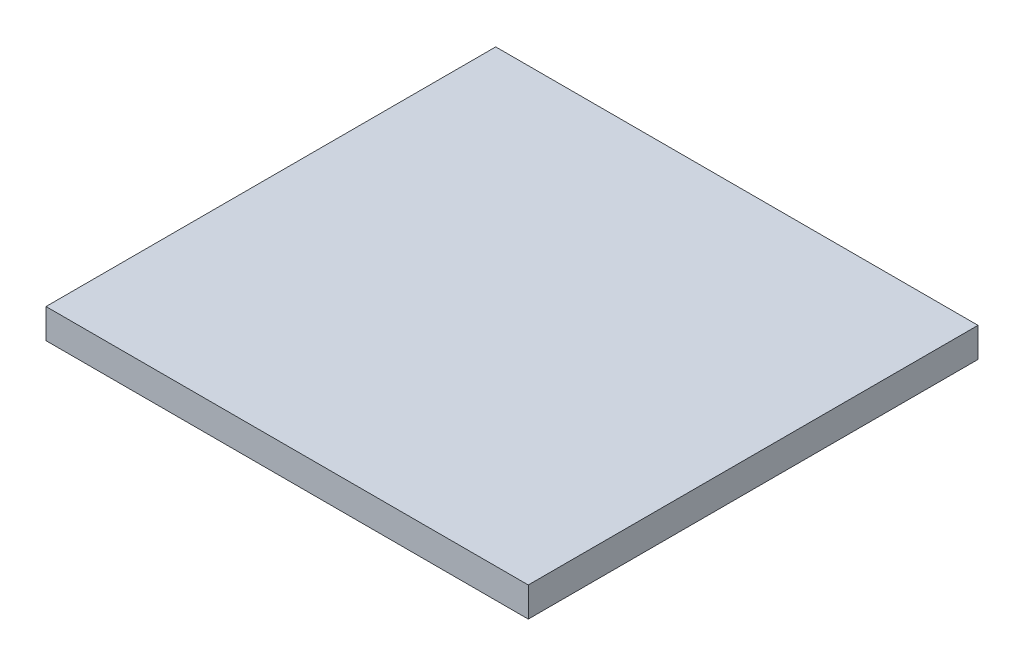
ISO-10303-21;
HEADER;
FILE_DESCRIPTION(('STEP AP214'),'2;1');
FILE_NAME('part.step','',(''),(''),'','','');
FILE_SCHEMA(('AUTOMOTIVE_DESIGN { 1 0 10303 214 1 1 1 1 }'));
ENDSEC;
DATA;
#1=APPLICATION_CONTEXT('core data for automotive mechanical design processes');
#2=APPLICATION_PROTOCOL_DEFINITION('international standard','automotive_design',2000,#1);
#3=PRODUCT_CONTEXT('',#1,'mechanical');
#4=PRODUCT('Part','Part','',(#3));
#5=PRODUCT_RELATED_PRODUCT_CATEGORY('part','',(#4));
#6=PRODUCT_DEFINITION_FORMATION('','',#4);
#7=PRODUCT_DEFINITION_CONTEXT('part definition',#1,'design');
#8=PRODUCT_DEFINITION('design','',#6,#7);
#9=PRODUCT_DEFINITION_SHAPE('','',#8);
#10=(LENGTH_UNIT() NAMED_UNIT(*) SI_UNIT(.MILLI.,.METRE.));
#11=(NAMED_UNIT(*) PLANE_ANGLE_UNIT() SI_UNIT($,.RADIAN.));
#12=(NAMED_UNIT(*) SI_UNIT($,.STERADIAN.) SOLID_ANGLE_UNIT());
#13=UNCERTAINTY_MEASURE_WITH_UNIT(LENGTH_MEASURE(1.E-05),#10,'distance_accuracy_value','');
#14=(GEOMETRIC_REPRESENTATION_CONTEXT(3) GLOBAL_UNCERTAINTY_ASSIGNED_CONTEXT((#13)) GLOBAL_UNIT_ASSIGNED_CONTEXT((#10,
#11,#12)) REPRESENTATION_CONTEXT('',''));
#15=CARTESIAN_POINT('',(0.,0.,0.));
#16=DIRECTION('',(0.,0.,1.));
#17=DIRECTION('',(1.,0.,0.));
#18=AXIS2_PLACEMENT_3D('',#15,#16,#17);
#19=CARTESIAN_POINT('',(-8.15,1.,7.6));
#20=DIRECTION('',(1.,0.,0.));
#21=DIRECTION('',(0.,0.,-1.));
#22=AXIS2_PLACEMENT_3D('',#19,#20,#21);
#23=PLANE('',#22);
#24=DIRECTION('',(0.,0.,1.));
#25=VECTOR('',#24,1.);
#26=CARTESIAN_POINT('',(-8.15,0.,7.6));
#27=LINE('',#26,#25);
#28=CARTESIAN_POINT('',(-8.15,0.,-7.6));
#29=VERTEX_POINT('',#28);
#30=CARTESIAN_POINT('',(-8.15,0.,7.6));
#31=VERTEX_POINT('',#30);
#32=EDGE_CURVE('E107',#29,#31,#27,.T.);
#33=ORIENTED_EDGE('',*,*,#32,.T.);
#34=DIRECTION('',(0.,-1.,0.));
#35=VECTOR('',#34,1.);
#36=CARTESIAN_POINT('',(-8.15,1.,7.6));
#37=LINE('',#36,#35);
#38=CARTESIAN_POINT('',(-8.15,1.,7.6));
#39=VERTEX_POINT('',#38);
#40=EDGE_CURVE('E11',#39,#31,#37,.T.);
#41=ORIENTED_EDGE('',*,*,#40,.F.);
#42=DIRECTION('',(0.,0.,1.));
#43=VECTOR('',#42,1.);
#44=CARTESIAN_POINT('',(-8.15,1.,7.6));
#45=LINE('',#44,#43);
#46=CARTESIAN_POINT('',(-8.15,1.,-7.6));
#47=VERTEX_POINT('',#46);
#48=EDGE_CURVE('E91',#47,#39,#45,.T.);
#49=ORIENTED_EDGE('',*,*,#48,.F.);
#50=DIRECTION('',(0.,-1.,0.));
#51=VECTOR('',#50,1.);
#52=CARTESIAN_POINT('',(-8.15,1.,-7.6));
#53=LINE('',#52,#51);
#54=EDGE_CURVE('E103',#47,#29,#53,.T.);
#55=ORIENTED_EDGE('',*,*,#54,.T.);
#56=EDGE_LOOP('',(#33,#41,#49,#55));
#57=FACE_BOUND('',#56,.T.);
#58=ADVANCED_FACE('F39',(#57),#23,.F.);
#59=CARTESIAN_POINT('',(8.15,1.,7.6));
#60=DIRECTION('',(0.,0.,-1.));
#61=DIRECTION('',(-1.,0.,0.));
#62=AXIS2_PLACEMENT_3D('',#59,#60,#61);
#63=PLANE('',#62);
#64=DIRECTION('',(1.,0.,0.));
#65=VECTOR('',#64,1.);
#66=CARTESIAN_POINT('',(8.15,0.,7.6));
#67=LINE('',#66,#65);
#68=CARTESIAN_POINT('',(8.15,0.,7.6));
#69=VERTEX_POINT('',#68);
#70=EDGE_CURVE('E96',#31,#69,#67,.T.);
#71=ORIENTED_EDGE('',*,*,#70,.T.);
#72=DIRECTION('',(0.,-1.,0.));
#73=VECTOR('',#72,1.);
#74=CARTESIAN_POINT('',(8.15,1.,7.6));
#75=LINE('',#74,#73);
#76=CARTESIAN_POINT('',(8.15,1.,7.6));
#77=VERTEX_POINT('',#76);
#78=EDGE_CURVE('E48',#77,#69,#75,.T.);
#79=ORIENTED_EDGE('',*,*,#78,.F.);
#80=DIRECTION('',(1.,0.,0.));
#81=VECTOR('',#80,1.);
#82=CARTESIAN_POINT('',(8.15,1.,7.6));
#83=LINE('',#82,#81);
#84=EDGE_CURVE('E86',#39,#77,#83,.T.);
#85=ORIENTED_EDGE('',*,*,#84,.F.);
#86=ORIENTED_EDGE('',*,*,#40,.T.);
#87=EDGE_LOOP('',(#71,#79,#85,#86));
#88=FACE_BOUND('',#87,.T.);
#89=ADVANCED_FACE('F95',(#88),#63,.F.);
#90=CARTESIAN_POINT('',(8.15,1.,7.6));
#91=DIRECTION('',(-1.,0.,0.));
#92=DIRECTION('',(0.,0.,1.));
#93=AXIS2_PLACEMENT_3D('',#90,#91,#92);
#94=PLANE('',#93);
#95=DIRECTION('',(0.,0.,-1.));
#96=VECTOR('',#95,1.);
#97=CARTESIAN_POINT('',(8.15,0.,7.6));
#98=LINE('',#97,#96);
#99=CARTESIAN_POINT('',(8.15,0.,-7.6));
#100=VERTEX_POINT('',#99);
#101=EDGE_CURVE('E73',#69,#100,#98,.T.);
#102=ORIENTED_EDGE('',*,*,#101,.T.);
#103=DIRECTION('',(0.,-1.,0.));
#104=VECTOR('',#103,1.);
#105=CARTESIAN_POINT('',(8.15,1.,-7.6));
#106=LINE('',#105,#104);
#107=CARTESIAN_POINT('',(8.15,1.,-7.6));
#108=VERTEX_POINT('',#107);
#109=EDGE_CURVE('E98',#108,#100,#106,.T.);
#110=ORIENTED_EDGE('',*,*,#109,.F.);
#111=DIRECTION('',(0.,0.,-1.));
#112=VECTOR('',#111,1.);
#113=CARTESIAN_POINT('',(8.15,1.,7.6));
#114=LINE('',#113,#112);
#115=EDGE_CURVE('E89',#77,#108,#114,.T.);
#116=ORIENTED_EDGE('',*,*,#115,.F.);
#117=ORIENTED_EDGE('',*,*,#78,.T.);
#118=EDGE_LOOP('',(#102,#110,#116,#117));
#119=FACE_BOUND('',#118,.T.);
#120=ADVANCED_FACE('F99',(#119),#94,.F.);
#121=CARTESIAN_POINT('',(8.15,1.,-7.6));
#122=DIRECTION('',(0.,0.,1.));
#123=DIRECTION('',(1.,0.,0.));
#124=AXIS2_PLACEMENT_3D('',#121,#122,#123);
#125=PLANE('',#124);
#126=DIRECTION('',(-1.,0.,0.));
#127=VECTOR('',#126,1.);
#128=CARTESIAN_POINT('',(8.15,0.,-7.6));
#129=LINE('',#128,#127);
#130=EDGE_CURVE('E79',#100,#29,#129,.T.);
#131=ORIENTED_EDGE('',*,*,#130,.T.);
#132=ORIENTED_EDGE('',*,*,#54,.F.);
#133=DIRECTION('',(-1.,0.,0.));
#134=VECTOR('',#133,1.);
#135=CARTESIAN_POINT('',(8.15,1.,-7.6));
#136=LINE('',#135,#134);
#137=EDGE_CURVE('E56',#108,#47,#136,.T.);
#138=ORIENTED_EDGE('',*,*,#137,.F.);
#139=ORIENTED_EDGE('',*,*,#109,.T.);
#140=EDGE_LOOP('',(#131,#132,#138,#139));
#141=FACE_BOUND('',#140,.T.);
#142=ADVANCED_FACE('F120',(#141),#125,.F.);
#143=CARTESIAN_POINT('',(0.,1.,0.));
#144=DIRECTION('',(0.,1.,0.));
#145=DIRECTION('',(0.,0.,1.));
#146=AXIS2_PLACEMENT_3D('',#143,#144,#145);
#147=PLANE('',#146);
#148=ORIENTED_EDGE('',*,*,#48,.T.);
#149=ORIENTED_EDGE('',*,*,#84,.T.);
#150=ORIENTED_EDGE('',*,*,#115,.T.);
#151=ORIENTED_EDGE('',*,*,#137,.T.);
#152=EDGE_LOOP('',(#148,#149,#150,#151));
#153=FACE_BOUND('',#152,.T.);
#154=ADVANCED_FACE('F87',(#153),#147,.T.);
#155=CARTESIAN_POINT('',(0.,0.,0.));
#156=DIRECTION('',(0.,1.,0.));
#157=DIRECTION('',(0.,0.,1.));
#158=AXIS2_PLACEMENT_3D('',#155,#156,#157);
#159=PLANE('',#158);
#160=ORIENTED_EDGE('',*,*,#32,.F.);
#161=ORIENTED_EDGE('',*,*,#130,.F.);
#162=ORIENTED_EDGE('',*,*,#101,.F.);
#163=ORIENTED_EDGE('',*,*,#70,.F.);
#164=EDGE_LOOP('',(#160,#161,#162,#163));
#165=FACE_BOUND('',#164,.T.);
#166=ADVANCED_FACE('F123',(#165),#159,.F.);
#167=CLOSED_SHELL('',(#58,#89,#120,#142,#154,#166));
#168=MANIFOLD_SOLID_BREP('B2',#167);
#169=ADVANCED_BREP_SHAPE_REPRESENTATION('',(#18,#168),#14);
#170=SHAPE_DEFINITION_REPRESENTATION(#9,#169);
ENDSEC;
END-ISO-10303-21;
